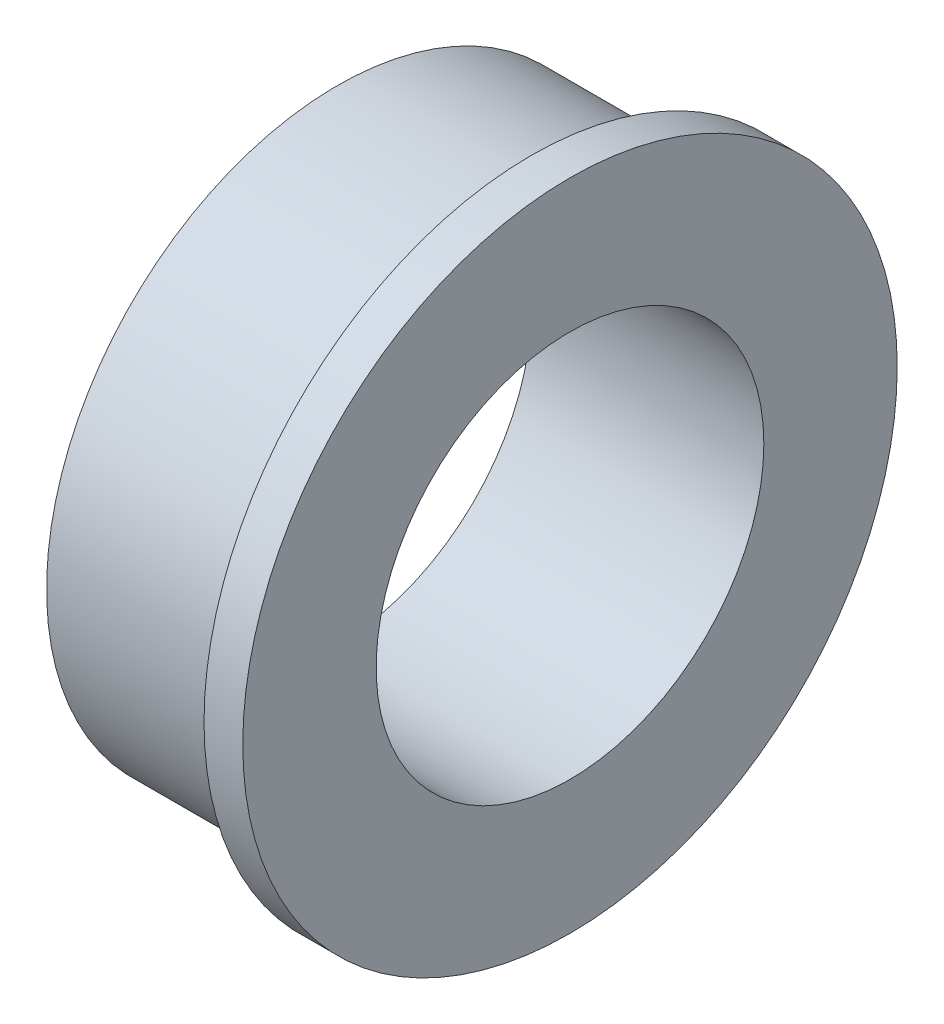
ISO-10303-21;
HEADER;
FILE_DESCRIPTION(('STEP AP214'),'2;1');
FILE_NAME('part.step','',(''),(''),'','','');
FILE_SCHEMA(('AUTOMOTIVE_DESIGN { 1 0 10303 214 1 1 1 1 }'));
ENDSEC;
DATA;
#1=APPLICATION_CONTEXT('core data for automotive mechanical design processes');
#2=APPLICATION_PROTOCOL_DEFINITION('international standard','automotive_design',2000,#1);
#3=PRODUCT_CONTEXT('',#1,'mechanical');
#4=PRODUCT('Part','Part','',(#3));
#5=PRODUCT_RELATED_PRODUCT_CATEGORY('part','',(#4));
#6=PRODUCT_DEFINITION_FORMATION('','',#4);
#7=PRODUCT_DEFINITION_CONTEXT('part definition',#1,'design');
#8=PRODUCT_DEFINITION('design','',#6,#7);
#9=PRODUCT_DEFINITION_SHAPE('','',#8);
#10=(LENGTH_UNIT() NAMED_UNIT(*) SI_UNIT(.MILLI.,.METRE.));
#11=(NAMED_UNIT(*) PLANE_ANGLE_UNIT() SI_UNIT($,.RADIAN.));
#12=(NAMED_UNIT(*) SI_UNIT($,.STERADIAN.) SOLID_ANGLE_UNIT());
#13=UNCERTAINTY_MEASURE_WITH_UNIT(LENGTH_MEASURE(1.E-05),#10,'distance_accuracy_value','');
#14=(GEOMETRIC_REPRESENTATION_CONTEXT(3) GLOBAL_UNCERTAINTY_ASSIGNED_CONTEXT((#13)) GLOBAL_UNIT_ASSIGNED_CONTEXT((#10,
#11,#12)) REPRESENTATION_CONTEXT('',''));
#15=CARTESIAN_POINT('',(0.,0.,0.));
#16=DIRECTION('',(0.,0.,1.));
#17=DIRECTION('',(1.,0.,0.));
#18=AXIS2_PLACEMENT_3D('',#15,#16,#17);
#19=CARTESIAN_POINT('',(0.,0.,0.));
#20=DIRECTION('',(1.,0.,0.));
#21=DIRECTION('',(0.,0.,-1.));
#22=AXIS2_PLACEMENT_3D('',#19,#20,#21);
#23=PLANE('',#22);
#24=CARTESIAN_POINT('',(0.,0.,0.));
#25=DIRECTION('',(1.,0.,0.));
#26=DIRECTION('',(0.,0.,-1.));
#27=AXIS2_PLACEMENT_3D('',#24,#25,#26);
#28=CIRCLE('',#27,4.7625);
#29=CARTESIAN_POINT('',(0.,0.,-4.7625));
#30=VERTEX_POINT('',#29);
#31=EDGE_CURVE('E49',#30,#30,#28,.T.);
#32=ORIENTED_EDGE('',*,*,#31,.F.);
#33=EDGE_LOOP('',(#32));
#34=FACE_BOUND('',#33,.T.);
#35=CARTESIAN_POINT('',(0.,0.,0.));
#36=DIRECTION('',(1.,0.,0.));
#37=DIRECTION('',(0.,0.,-1.));
#38=AXIS2_PLACEMENT_3D('',#35,#36,#37);
#39=CIRCLE('',#38,3.175);
#40=CARTESIAN_POINT('',(0.,0.,-3.175));
#41=VERTEX_POINT('',#40);
#42=EDGE_CURVE('E58',#41,#41,#39,.T.);
#43=ORIENTED_EDGE('',*,*,#42,.T.);
#44=EDGE_LOOP('',(#43));
#45=FACE_BOUND('',#44,.T.);
#46=ADVANCED_FACE('F45',(#34,#45),#23,.F.);
#47=CARTESIAN_POINT('',(3.175,0.,0.));
#48=DIRECTION('',(-1.,0.,0.));
#49=DIRECTION('',(0.,0.,1.));
#50=AXIS2_PLACEMENT_3D('',#47,#48,#49);
#51=CYLINDRICAL_SURFACE('',#50,4.7625);
#52=CARTESIAN_POINT('',(3.175,0.,0.));
#53=DIRECTION('',(1.,0.,0.));
#54=DIRECTION('',(0.,0.,-1.));
#55=AXIS2_PLACEMENT_3D('',#52,#53,#54);
#56=CIRCLE('',#55,4.7625);
#57=CARTESIAN_POINT('',(3.175,0.,-4.7625));
#58=VERTEX_POINT('',#57);
#59=EDGE_CURVE('E10',#58,#58,#56,.T.);
#60=ORIENTED_EDGE('',*,*,#59,.F.);
#61=EDGE_LOOP('',(#60));
#62=FACE_BOUND('',#61,.T.);
#63=ORIENTED_EDGE('',*,*,#31,.T.);
#64=EDGE_LOOP('',(#63));
#65=FACE_BOUND('',#64,.T.);
#66=ADVANCED_FACE('F47',(#62,#65),#51,.T.);
#67=CARTESIAN_POINT('',(3.175,0.,0.));
#68=DIRECTION('',(-1.,0.,0.));
#69=DIRECTION('',(0.,0.,1.));
#70=AXIS2_PLACEMENT_3D('',#67,#68,#69);
#71=CYLINDRICAL_SURFACE('',#70,3.175);
#72=ORIENTED_EDGE('',*,*,#42,.F.);
#73=EDGE_LOOP('',(#72));
#74=FACE_BOUND('',#73,.T.);
#75=CARTESIAN_POINT('',(3.81,0.,0.));
#76=DIRECTION('',(1.,0.,0.));
#77=DIRECTION('',(0.,0.,-1.));
#78=AXIS2_PLACEMENT_3D('',#75,#76,#77);
#79=CIRCLE('',#78,3.175);
#80=CARTESIAN_POINT('',(3.81,0.,-3.175));
#81=VERTEX_POINT('',#80);
#82=EDGE_CURVE('E68',#81,#81,#79,.T.);
#83=ORIENTED_EDGE('',*,*,#82,.T.);
#84=EDGE_LOOP('',(#83));
#85=FACE_BOUND('',#84,.T.);
#86=ADVANCED_FACE('F76',(#74,#85),#71,.F.);
#87=CARTESIAN_POINT('',(3.81,0.,0.));
#88=DIRECTION('',(1.,0.,0.));
#89=DIRECTION('',(0.,0.,-1.));
#90=AXIS2_PLACEMENT_3D('',#87,#88,#89);
#91=PLANE('',#90);
#92=CARTESIAN_POINT('',(3.81,0.,0.));
#93=DIRECTION('',(1.,0.,0.));
#94=DIRECTION('',(0.,0.,-1.));
#95=AXIS2_PLACEMENT_3D('',#92,#93,#94);
#96=CIRCLE('',#95,5.3594);
#97=CARTESIAN_POINT('',(3.81,0.,-5.3594));
#98=VERTEX_POINT('',#97);
#99=EDGE_CURVE('E63',#98,#98,#96,.T.);
#100=ORIENTED_EDGE('',*,*,#99,.T.);
#101=EDGE_LOOP('',(#100));
#102=FACE_BOUND('',#101,.T.);
#103=ORIENTED_EDGE('',*,*,#82,.F.);
#104=EDGE_LOOP('',(#103));
#105=FACE_BOUND('',#104,.T.);
#106=ADVANCED_FACE('F78',(#102,#105),#91,.T.);
#107=CARTESIAN_POINT('',(3.175,0.,0.));
#108=DIRECTION('',(1.,0.,0.));
#109=DIRECTION('',(0.,0.,-1.));
#110=AXIS2_PLACEMENT_3D('',#107,#108,#109);
#111=PLANE('',#110);
#112=ORIENTED_EDGE('',*,*,#59,.T.);
#113=EDGE_LOOP('',(#112));
#114=FACE_BOUND('',#113,.T.);
#115=CARTESIAN_POINT('',(3.175,0.,0.));
#116=DIRECTION('',(1.,0.,0.));
#117=DIRECTION('',(0.,0.,-1.));
#118=AXIS2_PLACEMENT_3D('',#115,#116,#117);
#119=CIRCLE('',#118,5.3594);
#120=CARTESIAN_POINT('',(3.175,0.,-5.3594));
#121=VERTEX_POINT('',#120);
#122=EDGE_CURVE('E64',#121,#121,#119,.T.);
#123=ORIENTED_EDGE('',*,*,#122,.F.);
#124=EDGE_LOOP('',(#123));
#125=FACE_BOUND('',#124,.T.);
#126=ADVANCED_FACE('F80',(#114,#125),#111,.F.);
#127=CARTESIAN_POINT('',(3.81,0.,0.));
#128=DIRECTION('',(-1.,0.,0.));
#129=DIRECTION('',(0.,0.,1.));
#130=AXIS2_PLACEMENT_3D('',#127,#128,#129);
#131=CYLINDRICAL_SURFACE('',#130,5.3594);
#132=ORIENTED_EDGE('',*,*,#99,.F.);
#133=EDGE_LOOP('',(#132));
#134=FACE_BOUND('',#133,.T.);
#135=ORIENTED_EDGE('',*,*,#122,.T.);
#136=EDGE_LOOP('',(#135));
#137=FACE_BOUND('',#136,.T.);
#138=ADVANCED_FACE('F86',(#134,#137),#131,.T.);
#139=CLOSED_SHELL('',(#46,#66,#86,#106,#126,#138));
#140=MANIFOLD_SOLID_BREP('B2',#139);
#141=ADVANCED_BREP_SHAPE_REPRESENTATION('',(#18,#140),#14);
#142=SHAPE_DEFINITION_REPRESENTATION(#9,#141);
ENDSEC;
END-ISO-10303-21;
